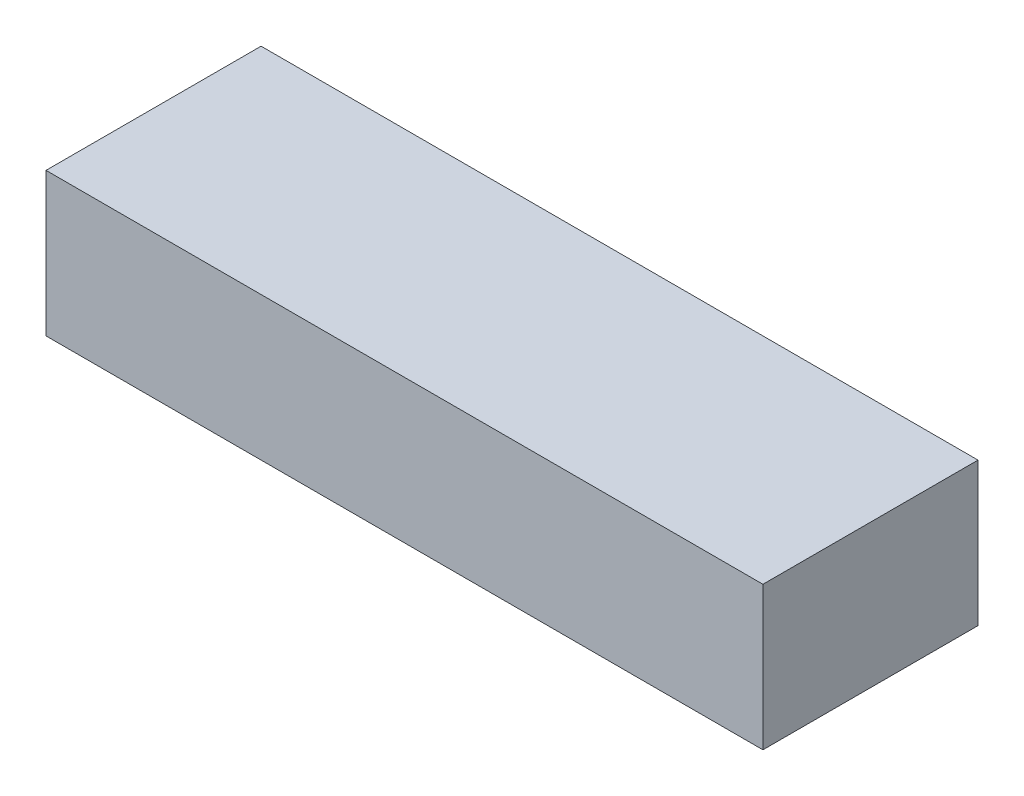
ISO-10303-21;
HEADER;
FILE_DESCRIPTION(('STEP AP214'),'2;1');
FILE_NAME('part.step','',(''),(''),'','','');
FILE_SCHEMA(('AUTOMOTIVE_DESIGN { 1 0 10303 214 1 1 1 1 }'));
ENDSEC;
DATA;
#1=APPLICATION_CONTEXT('core data for automotive mechanical design processes');
#2=APPLICATION_PROTOCOL_DEFINITION('international standard','automotive_design',2000,#1);
#3=PRODUCT_CONTEXT('',#1,'mechanical');
#4=PRODUCT('Part','Part','',(#3));
#5=PRODUCT_RELATED_PRODUCT_CATEGORY('part','',(#4));
#6=PRODUCT_DEFINITION_FORMATION('','',#4);
#7=PRODUCT_DEFINITION_CONTEXT('part definition',#1,'design');
#8=PRODUCT_DEFINITION('design','',#6,#7);
#9=PRODUCT_DEFINITION_SHAPE('','',#8);
#10=(LENGTH_UNIT() NAMED_UNIT(*) SI_UNIT(.MILLI.,.METRE.));
#11=(NAMED_UNIT(*) PLANE_ANGLE_UNIT() SI_UNIT($,.RADIAN.));
#12=(NAMED_UNIT(*) SI_UNIT($,.STERADIAN.) SOLID_ANGLE_UNIT());
#13=UNCERTAINTY_MEASURE_WITH_UNIT(LENGTH_MEASURE(1.E-05),#10,'distance_accuracy_value','');
#14=(GEOMETRIC_REPRESENTATION_CONTEXT(3) GLOBAL_UNCERTAINTY_ASSIGNED_CONTEXT((#13)) GLOBAL_UNIT_ASSIGNED_CONTEXT((#10,
#11,#12)) REPRESENTATION_CONTEXT('',''));
#15=CARTESIAN_POINT('',(0.,0.,0.));
#16=DIRECTION('',(0.,0.,1.));
#17=DIRECTION('',(1.,0.,0.));
#18=AXIS2_PLACEMENT_3D('',#15,#16,#17);
#19=CARTESIAN_POINT('',(-5.,-1.,3.));
#20=DIRECTION('',(1.,0.,0.));
#21=DIRECTION('',(0.,0.,-1.));
#22=AXIS2_PLACEMENT_3D('',#19,#20,#21);
#23=PLANE('',#22);
#24=DIRECTION('',(0.,-1.,0.));
#25=VECTOR('',#24,1.);
#26=CARTESIAN_POINT('',(-5.,-1.,0.));
#27=LINE('',#26,#25);
#28=CARTESIAN_POINT('',(-5.,0.999999999999999,0.));
#29=VERTEX_POINT('',#28);
#30=CARTESIAN_POINT('',(-5.,-1.,0.));
#31=VERTEX_POINT('',#30);
#32=EDGE_CURVE('E96',#29,#31,#27,.T.);
#33=ORIENTED_EDGE('',*,*,#32,.T.);
#34=DIRECTION('',(0.,0.,-1.));
#35=VECTOR('',#34,1.);
#36=CARTESIAN_POINT('',(-5.,-1.,3.));
#37=LINE('',#36,#35);
#38=CARTESIAN_POINT('',(-5.,-1.,3.));
#39=VERTEX_POINT('',#38);
#40=EDGE_CURVE('E11',#39,#31,#37,.T.);
#41=ORIENTED_EDGE('',*,*,#40,.F.);
#42=DIRECTION('',(0.,-1.,0.));
#43=VECTOR('',#42,1.);
#44=CARTESIAN_POINT('',(-5.,-1.,3.));
#45=LINE('',#44,#43);
#46=CARTESIAN_POINT('',(-5.,0.999999999999999,3.));
#47=VERTEX_POINT('',#46);
#48=EDGE_CURVE('E84',#47,#39,#45,.T.);
#49=ORIENTED_EDGE('',*,*,#48,.F.);
#50=DIRECTION('',(0.,0.,-1.));
#51=VECTOR('',#50,1.);
#52=CARTESIAN_POINT('',(-5.,0.999999999999999,3.));
#53=LINE('',#52,#51);
#54=EDGE_CURVE('E92',#47,#29,#53,.T.);
#55=ORIENTED_EDGE('',*,*,#54,.T.);
#56=EDGE_LOOP('',(#33,#41,#49,#55));
#57=FACE_BOUND('',#56,.T.);
#58=ADVANCED_FACE('F33',(#57),#23,.F.);
#59=CARTESIAN_POINT('',(5.,-0.999999999999999,3.));
#60=DIRECTION('',(0.,1.,0.));
#61=DIRECTION('',(-1.,0.,0.));
#62=AXIS2_PLACEMENT_3D('',#59,#60,#61);
#63=PLANE('',#62);
#64=DIRECTION('',(1.,0.,0.));
#65=VECTOR('',#64,1.);
#66=CARTESIAN_POINT('',(5.,-0.999999999999999,0.));
#67=LINE('',#66,#65);
#68=CARTESIAN_POINT('',(5.,-0.999999999999999,0.));
#69=VERTEX_POINT('',#68);
#70=EDGE_CURVE('E88',#31,#69,#67,.T.);
#71=ORIENTED_EDGE('',*,*,#70,.T.);
#72=DIRECTION('',(0.,0.,-1.));
#73=VECTOR('',#72,1.);
#74=CARTESIAN_POINT('',(5.,-0.999999999999999,3.));
#75=LINE('',#74,#73);
#76=CARTESIAN_POINT('',(5.,-0.999999999999999,3.));
#77=VERTEX_POINT('',#76);
#78=EDGE_CURVE('E41',#77,#69,#75,.T.);
#79=ORIENTED_EDGE('',*,*,#78,.F.);
#80=DIRECTION('',(1.,0.,0.));
#81=VECTOR('',#80,1.);
#82=CARTESIAN_POINT('',(5.,-0.999999999999999,3.));
#83=LINE('',#82,#81);
#84=EDGE_CURVE('E79',#39,#77,#83,.T.);
#85=ORIENTED_EDGE('',*,*,#84,.F.);
#86=ORIENTED_EDGE('',*,*,#40,.T.);
#87=EDGE_LOOP('',(#71,#79,#85,#86));
#88=FACE_BOUND('',#87,.T.);
#89=ADVANCED_FACE('F87',(#88),#63,.F.);
#90=CARTESIAN_POINT('',(5.,-0.999999999999999,3.));
#91=DIRECTION('',(-1.,0.,0.));
#92=DIRECTION('',(0.,0.,1.));
#93=AXIS2_PLACEMENT_3D('',#90,#91,#92);
#94=PLANE('',#93);
#95=DIRECTION('',(0.,1.,0.));
#96=VECTOR('',#95,1.);
#97=CARTESIAN_POINT('',(5.,-0.999999999999999,0.));
#98=LINE('',#97,#96);
#99=CARTESIAN_POINT('',(5.,1.,0.));
#100=VERTEX_POINT('',#99);
#101=EDGE_CURVE('E66',#69,#100,#98,.T.);
#102=ORIENTED_EDGE('',*,*,#101,.T.);
#103=DIRECTION('',(0.,0.,-1.));
#104=VECTOR('',#103,1.);
#105=CARTESIAN_POINT('',(5.,1.,3.));
#106=LINE('',#105,#104);
#107=CARTESIAN_POINT('',(5.,1.,3.));
#108=VERTEX_POINT('',#107);
#109=EDGE_CURVE('E89',#108,#100,#106,.T.);
#110=ORIENTED_EDGE('',*,*,#109,.F.);
#111=DIRECTION('',(0.,1.,0.));
#112=VECTOR('',#111,1.);
#113=CARTESIAN_POINT('',(5.,-0.999999999999999,3.));
#114=LINE('',#113,#112);
#115=EDGE_CURVE('E82',#77,#108,#114,.T.);
#116=ORIENTED_EDGE('',*,*,#115,.F.);
#117=ORIENTED_EDGE('',*,*,#78,.T.);
#118=EDGE_LOOP('',(#102,#110,#116,#117));
#119=FACE_BOUND('',#118,.T.);
#120=ADVANCED_FACE('F90',(#119),#94,.F.);
#121=CARTESIAN_POINT('',(5.,1.,3.));
#122=DIRECTION('',(0.,-1.,0.));
#123=DIRECTION('',(1.,0.,0.));
#124=AXIS2_PLACEMENT_3D('',#121,#122,#123);
#125=PLANE('',#124);
#126=DIRECTION('',(-1.,0.,0.));
#127=VECTOR('',#126,1.);
#128=CARTESIAN_POINT('',(5.,1.,0.));
#129=LINE('',#128,#127);
#130=EDGE_CURVE('E72',#100,#29,#129,.T.);
#131=ORIENTED_EDGE('',*,*,#130,.T.);
#132=ORIENTED_EDGE('',*,*,#54,.F.);
#133=DIRECTION('',(-1.,0.,0.));
#134=VECTOR('',#133,1.);
#135=CARTESIAN_POINT('',(5.,1.,3.));
#136=LINE('',#135,#134);
#137=EDGE_CURVE('E49',#108,#47,#136,.T.);
#138=ORIENTED_EDGE('',*,*,#137,.F.);
#139=ORIENTED_EDGE('',*,*,#109,.T.);
#140=EDGE_LOOP('',(#131,#132,#138,#139));
#141=FACE_BOUND('',#140,.T.);
#142=ADVANCED_FACE('F103',(#141),#125,.F.);
#143=CARTESIAN_POINT('',(0.,0.,3.));
#144=DIRECTION('',(0.,0.,1.));
#145=DIRECTION('',(1.,0.,0.));
#146=AXIS2_PLACEMENT_3D('',#143,#144,#145);
#147=PLANE('',#146);
#148=ORIENTED_EDGE('',*,*,#48,.T.);
#149=ORIENTED_EDGE('',*,*,#84,.T.);
#150=ORIENTED_EDGE('',*,*,#115,.T.);
#151=ORIENTED_EDGE('',*,*,#137,.T.);
#152=EDGE_LOOP('',(#148,#149,#150,#151));
#153=FACE_BOUND('',#152,.T.);
#154=ADVANCED_FACE('F80',(#153),#147,.T.);
#155=CARTESIAN_POINT('',(0.,0.,0.));
#156=DIRECTION('',(0.,0.,1.));
#157=DIRECTION('',(1.,0.,0.));
#158=AXIS2_PLACEMENT_3D('',#155,#156,#157);
#159=PLANE('',#158);
#160=ORIENTED_EDGE('',*,*,#32,.F.);
#161=ORIENTED_EDGE('',*,*,#130,.F.);
#162=ORIENTED_EDGE('',*,*,#101,.F.);
#163=ORIENTED_EDGE('',*,*,#70,.F.);
#164=EDGE_LOOP('',(#160,#161,#162,#163));
#165=FACE_BOUND('',#164,.T.);
#166=ADVANCED_FACE('F106',(#165),#159,.F.);
#167=CLOSED_SHELL('',(#58,#89,#120,#142,#154,#166));
#168=MANIFOLD_SOLID_BREP('B2',#167);
#169=ADVANCED_BREP_SHAPE_REPRESENTATION('',(#18,#168),#14);
#170=SHAPE_DEFINITION_REPRESENTATION(#9,#169);
ENDSEC;
END-ISO-10303-21;
